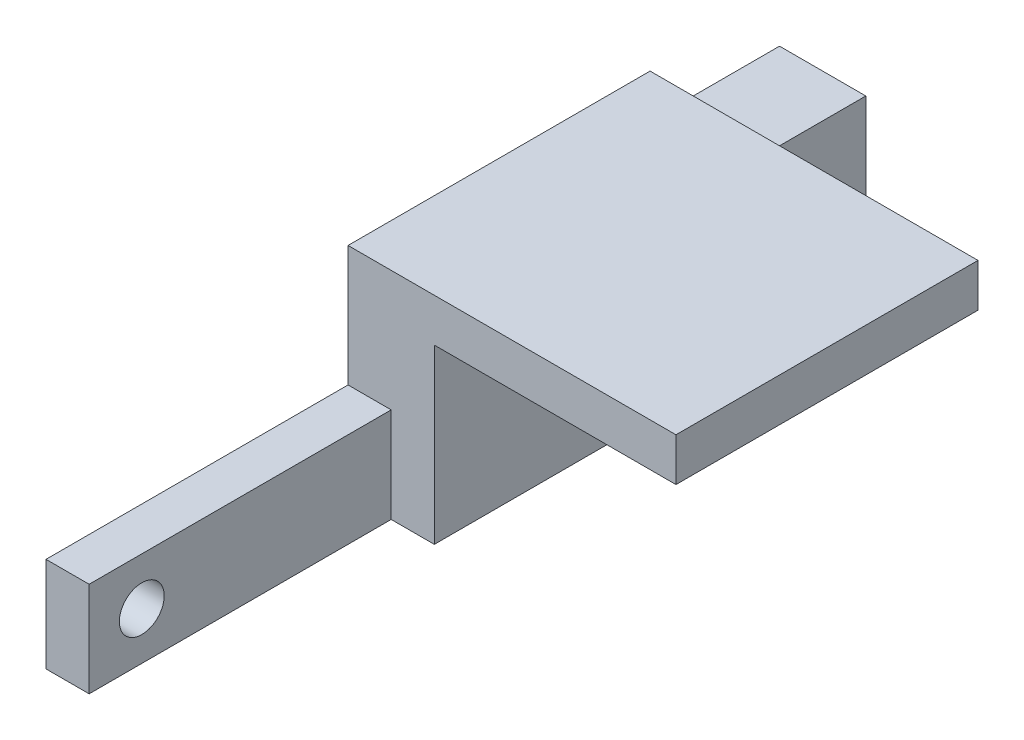
ISO-10303-21;
HEADER;
FILE_DESCRIPTION(('STEP AP214'),'2;1');
FILE_NAME('part.step','',(''),(''),'','','');
FILE_SCHEMA(('AUTOMOTIVE_DESIGN { 1 0 10303 214 1 1 1 1 }'));
ENDSEC;
DATA;
#1=APPLICATION_CONTEXT('core data for automotive mechanical design processes');
#2=APPLICATION_PROTOCOL_DEFINITION('international standard','automotive_design',2000,#1);
#3=PRODUCT_CONTEXT('',#1,'mechanical');
#4=PRODUCT('Part','Part','',(#3));
#5=PRODUCT_RELATED_PRODUCT_CATEGORY('part','',(#4));
#6=PRODUCT_DEFINITION_FORMATION('','',#4);
#7=PRODUCT_DEFINITION_CONTEXT('part definition',#1,'design');
#8=PRODUCT_DEFINITION('design','',#6,#7);
#9=PRODUCT_DEFINITION_SHAPE('','',#8);
#10=(LENGTH_UNIT() NAMED_UNIT(*) SI_UNIT(.MILLI.,.METRE.));
#11=(NAMED_UNIT(*) PLANE_ANGLE_UNIT() SI_UNIT($,.RADIAN.));
#12=(NAMED_UNIT(*) SI_UNIT($,.STERADIAN.) SOLID_ANGLE_UNIT());
#13=UNCERTAINTY_MEASURE_WITH_UNIT(LENGTH_MEASURE(1.E-05),#10,'distance_accuracy_value','');
#14=(GEOMETRIC_REPRESENTATION_CONTEXT(3) GLOBAL_UNCERTAINTY_ASSIGNED_CONTEXT((#13)) GLOBAL_UNIT_ASSIGNED_CONTEXT((#10,
#11,#12)) REPRESENTATION_CONTEXT('',''));
#15=CARTESIAN_POINT('',(0.,0.,0.));
#16=DIRECTION('',(0.,0.,1.));
#17=DIRECTION('',(1.,0.,0.));
#18=AXIS2_PLACEMENT_3D('',#15,#16,#17);
#19=CARTESIAN_POINT('',(38.,5.,35.));
#20=DIRECTION('',(0.,0.,1.));
#21=DIRECTION('',(1.,0.,0.));
#22=AXIS2_PLACEMENT_3D('',#19,#20,#21);
#23=PLANE('',#22);
#24=DIRECTION('',(0.,-1.,0.));
#25=VECTOR('',#24,1.);
#26=CARTESIAN_POINT('',(0.,5.,35.));
#27=LINE('',#26,#25);
#28=CARTESIAN_POINT('',(0.,5.,35.));
#29=VERTEX_POINT('',#28);
#30=CARTESIAN_POINT('',(0.,-8.99999999999996,35.));
#31=VERTEX_POINT('',#30);
#32=EDGE_CURVE('E212',#29,#31,#27,.T.);
#33=ORIENTED_EDGE('',*,*,#32,.T.);
#34=DIRECTION('',(1.,0.,0.));
#35=VECTOR('',#34,1.);
#36=CARTESIAN_POINT('',(-36.6878726556883,-8.99999999999996,35.));
#37=LINE('',#36,#35);
#38=CARTESIAN_POINT('',(5.,-8.99999999999996,35.));
#39=VERTEX_POINT('',#38);
#40=EDGE_CURVE('E156',#31,#39,#37,.T.);
#41=ORIENTED_EDGE('',*,*,#40,.T.);
#42=DIRECTION('',(0.,-1.,0.));
#43=VECTOR('',#42,1.);
#44=CARTESIAN_POINT('',(5.,-8.99999999999996,35.));
#45=LINE('',#44,#43);
#46=CARTESIAN_POINT('',(5.,-20.,35.));
#47=VERTEX_POINT('',#46);
#48=EDGE_CURVE('E150',#39,#47,#45,.T.);
#49=ORIENTED_EDGE('',*,*,#48,.T.);
#50=DIRECTION('',(-1.,0.,0.));
#51=VECTOR('',#50,1.);
#52=CARTESIAN_POINT('',(10.,-20.,35.));
#53=LINE('',#52,#51);
#54=CARTESIAN_POINT('',(10.,-20.,35.));
#55=VERTEX_POINT('',#54);
#56=EDGE_CURVE('E149',#55,#47,#53,.T.);
#57=ORIENTED_EDGE('',*,*,#56,.F.);
#58=DIRECTION('',(0.,1.,0.));
#59=VECTOR('',#58,1.);
#60=CARTESIAN_POINT('',(10.,-20.,35.));
#61=LINE('',#60,#59);
#62=CARTESIAN_POINT('',(10.,0.,35.));
#63=VERTEX_POINT('',#62);
#64=EDGE_CURVE('E185',#55,#63,#61,.T.);
#65=ORIENTED_EDGE('',*,*,#64,.T.);
#66=DIRECTION('',(-1.,0.,0.));
#67=VECTOR('',#66,1.);
#68=CARTESIAN_POINT('',(38.,0.,35.));
#69=LINE('',#68,#67);
#70=CARTESIAN_POINT('',(38.,0.,35.));
#71=VERTEX_POINT('',#70);
#72=EDGE_CURVE('E205',#71,#63,#69,.T.);
#73=ORIENTED_EDGE('',*,*,#72,.F.);
#74=DIRECTION('',(0.,-1.,0.));
#75=VECTOR('',#74,1.);
#76=CARTESIAN_POINT('',(38.,5.,35.));
#77=LINE('',#76,#75);
#78=CARTESIAN_POINT('',(38.,5.,35.));
#79=VERTEX_POINT('',#78);
#80=EDGE_CURVE('E56',#79,#71,#77,.T.);
#81=ORIENTED_EDGE('',*,*,#80,.F.);
#82=DIRECTION('',(-1.,0.,0.));
#83=VECTOR('',#82,1.);
#84=CARTESIAN_POINT('',(38.,5.,35.));
#85=LINE('',#84,#83);
#86=EDGE_CURVE('E195',#79,#29,#85,.T.);
#87=ORIENTED_EDGE('',*,*,#86,.T.);
#88=EDGE_LOOP('',(#33,#41,#49,#57,#65,#73,#81,#87));
#89=FACE_BOUND('',#88,.T.);
#90=ADVANCED_FACE('F52',(#89),#23,.T.);
#91=CARTESIAN_POINT('',(0.,0.,0.));
#92=DIRECTION('',(0.,-1.,0.));
#93=DIRECTION('',(0.,0.,-1.));
#94=AXIS2_PLACEMENT_3D('',#91,#92,#93);
#95=PLANE('',#94);
#96=ORIENTED_EDGE('',*,*,#72,.T.);
#97=DIRECTION('',(0.,0.,-1.));
#98=VECTOR('',#97,1.);
#99=CARTESIAN_POINT('',(10.,0.,35.));
#100=LINE('',#99,#98);
#101=CARTESIAN_POINT('',(10.,0.,0.));
#102=VERTEX_POINT('',#101);
#103=EDGE_CURVE('E178',#63,#102,#100,.T.);
#104=ORIENTED_EDGE('',*,*,#103,.T.);
#105=DIRECTION('',(-1.,0.,0.));
#106=VECTOR('',#105,1.);
#107=CARTESIAN_POINT('',(38.,0.,0.));
#108=LINE('',#107,#106);
#109=CARTESIAN_POINT('',(38.,0.,0.));
#110=VERTEX_POINT('',#109);
#111=EDGE_CURVE('E196',#110,#102,#108,.T.);
#112=ORIENTED_EDGE('',*,*,#111,.F.);
#113=DIRECTION('',(0.,0.,1.));
#114=VECTOR('',#113,1.);
#115=CARTESIAN_POINT('',(38.,0.,0.));
#116=LINE('',#115,#114);
#117=EDGE_CURVE('E187',#110,#71,#116,.T.);
#118=ORIENTED_EDGE('',*,*,#117,.T.);
#119=EDGE_LOOP('',(#96,#104,#112,#118));
#120=FACE_BOUND('',#119,.T.);
#121=ADVANCED_FACE('F223',(#120),#95,.T.);
#122=CARTESIAN_POINT('',(38.,5.,0.));
#123=DIRECTION('',(1.,0.,0.));
#124=DIRECTION('',(0.,0.,-1.));
#125=AXIS2_PLACEMENT_3D('',#122,#123,#124);
#126=PLANE('',#125);
#127=ORIENTED_EDGE('',*,*,#117,.F.);
#128=DIRECTION('',(0.,-1.,0.));
#129=VECTOR('',#128,1.);
#130=CARTESIAN_POINT('',(38.,5.,0.));
#131=LINE('',#130,#129);
#132=CARTESIAN_POINT('',(38.,5.,0.));
#133=VERTEX_POINT('',#132);
#134=EDGE_CURVE('E12',#133,#110,#131,.T.);
#135=ORIENTED_EDGE('',*,*,#134,.F.);
#136=DIRECTION('',(0.,0.,1.));
#137=VECTOR('',#136,1.);
#138=CARTESIAN_POINT('',(38.,5.,0.));
#139=LINE('',#138,#137);
#140=EDGE_CURVE('E192',#133,#79,#139,.T.);
#141=ORIENTED_EDGE('',*,*,#140,.T.);
#142=ORIENTED_EDGE('',*,*,#80,.T.);
#143=EDGE_LOOP('',(#127,#135,#141,#142));
#144=FACE_BOUND('',#143,.T.);
#145=ADVANCED_FACE('F54',(#144),#126,.T.);
#146=CARTESIAN_POINT('',(38.,5.,0.));
#147=DIRECTION('',(0.,0.,1.));
#148=DIRECTION('',(1.,0.,0.));
#149=AXIS2_PLACEMENT_3D('',#146,#147,#148);
#150=PLANE('',#149);
#151=ORIENTED_EDGE('',*,*,#111,.T.);
#152=CARTESIAN_POINT('',(0.,0.,0.));
#153=VERTEX_POINT('',#152);
#154=EDGE_CURVE('E208',#102,#153,#108,.T.);
#155=ORIENTED_EDGE('',*,*,#154,.T.);
#156=DIRECTION('',(0.,-1.,0.));
#157=VECTOR('',#156,1.);
#158=CARTESIAN_POINT('',(0.,5.,0.));
#159=LINE('',#158,#157);
#160=CARTESIAN_POINT('',(0.,5.,0.));
#161=VERTEX_POINT('',#160);
#162=EDGE_CURVE('E61',#161,#153,#159,.T.);
#163=ORIENTED_EDGE('',*,*,#162,.F.);
#164=DIRECTION('',(-1.,0.,0.));
#165=VECTOR('',#164,1.);
#166=CARTESIAN_POINT('',(38.,5.,0.));
#167=LINE('',#166,#165);
#168=EDGE_CURVE('E201',#133,#161,#167,.T.);
#169=ORIENTED_EDGE('',*,*,#168,.F.);
#170=ORIENTED_EDGE('',*,*,#134,.T.);
#171=EDGE_LOOP('',(#151,#155,#163,#169,#170));
#172=FACE_BOUND('',#171,.T.);
#173=ADVANCED_FACE('F226',(#172),#150,.F.);
#174=CARTESIAN_POINT('',(0.,5.,0.));
#175=DIRECTION('',(1.,0.,0.));
#176=DIRECTION('',(0.,0.,-1.));
#177=AXIS2_PLACEMENT_3D('',#174,#175,#176);
#178=PLANE('',#177);
#179=CARTESIAN_POINT('',(0.,-14.5,56.3000000000001));
#180=DIRECTION('',(1.,0.,0.));
#181=DIRECTION('',(0.,0.,-1.));
#182=AXIS2_PLACEMENT_3D('',#179,#180,#181);
#183=CIRCLE('',#182,0.599999999999993);
#184=CARTESIAN_POINT('',(0.,-14.5,55.7000000000001));
#185=VERTEX_POINT('',#184);
#186=EDGE_CURVE('E252',#185,#185,#183,.T.);
#187=ORIENTED_EDGE('',*,*,#186,.T.);
#188=EDGE_LOOP('',(#187));
#189=FACE_BOUND('',#188,.T.);
#190=CARTESIAN_POINT('',(0.,-14.5,51.4000000000001));
#191=DIRECTION('',(1.,0.,0.));
#192=DIRECTION('',(0.,0.,-1.));
#193=AXIS2_PLACEMENT_3D('',#190,#191,#192);
#194=CIRCLE('',#193,1.5);
#195=CARTESIAN_POINT('',(0.,-14.5,49.9000000000001));
#196=VERTEX_POINT('',#195);
#197=EDGE_CURVE('E249',#196,#196,#194,.T.);
#198=ORIENTED_EDGE('',*,*,#197,.T.);
#199=EDGE_LOOP('',(#198));
#200=FACE_BOUND('',#199,.T.);
#201=ORIENTED_EDGE('',*,*,#162,.T.);
#202=DIRECTION('',(0.,0.,-1.));
#203=VECTOR('',#202,1.);
#204=CARTESIAN_POINT('',(0.,0.,35.));
#205=LINE('',#204,#203);
#206=CARTESIAN_POINT('',(0.,0.,-15.));
#207=VERTEX_POINT('',#206);
#208=EDGE_CURVE('E171',#153,#207,#205,.T.);
#209=ORIENTED_EDGE('',*,*,#208,.T.);
#210=DIRECTION('',(0.,1.,0.));
#211=VECTOR('',#210,1.);
#212=CARTESIAN_POINT('',(0.,-20.,-15.));
#213=LINE('',#212,#211);
#214=CARTESIAN_POINT('',(0.,-20.,-15.));
#215=VERTEX_POINT('',#214);
#216=EDGE_CURVE('E188',#215,#207,#213,.T.);
#217=ORIENTED_EDGE('',*,*,#216,.F.);
#218=DIRECTION('',(0.,0.,-1.));
#219=VECTOR('',#218,1.);
#220=CARTESIAN_POINT('',(0.,-20.,35.));
#221=LINE('',#220,#219);
#222=CARTESIAN_POINT('',(0.,-20.,70.));
#223=VERTEX_POINT('',#222);
#224=EDGE_CURVE('E174',#223,#215,#221,.T.);
#225=ORIENTED_EDGE('',*,*,#224,.F.);
#226=DIRECTION('',(0.,1.,0.));
#227=VECTOR('',#226,1.);
#228=CARTESIAN_POINT('',(0.,-8.99999999999997,70.));
#229=LINE('',#228,#227);
#230=CARTESIAN_POINT('',(0.,-8.99999999999997,70.));
#231=VERTEX_POINT('',#230);
#232=EDGE_CURVE('E141',#223,#231,#229,.T.);
#233=ORIENTED_EDGE('',*,*,#232,.T.);
#234=DIRECTION('',(0.,0.,-1.));
#235=VECTOR('',#234,1.);
#236=CARTESIAN_POINT('',(0.,-8.99999999999996,35.));
#237=LINE('',#236,#235);
#238=EDGE_CURVE('E166',#231,#31,#237,.T.);
#239=ORIENTED_EDGE('',*,*,#238,.T.);
#240=ORIENTED_EDGE('',*,*,#32,.F.);
#241=DIRECTION('',(0.,0.,1.));
#242=VECTOR('',#241,1.);
#243=CARTESIAN_POINT('',(0.,5.,0.));
#244=LINE('',#243,#242);
#245=EDGE_CURVE('E199',#161,#29,#244,.T.);
#246=ORIENTED_EDGE('',*,*,#245,.F.);
#247=EDGE_LOOP('',(#201,#209,#217,#225,#233,#239,#240,#246));
#248=FACE_BOUND('',#247,.T.);
#249=CARTESIAN_POINT('',(0.,-14.5,63.9000000000001));
#250=DIRECTION('',(1.,0.,0.));
#251=DIRECTION('',(0.,0.,-1.));
#252=AXIS2_PLACEMENT_3D('',#249,#250,#251);
#253=CIRCLE('',#252,2.6);
#254=CARTESIAN_POINT('',(0.,-14.5,61.3000000000001));
#255=VERTEX_POINT('',#254);
#256=EDGE_CURVE('E163',#255,#255,#253,.F.);
#257=ORIENTED_EDGE('',*,*,#256,.F.);
#258=EDGE_LOOP('',(#257));
#259=FACE_BOUND('',#258,.T.);
#260=ADVANCED_FACE('F233',(#189,#200,#248,#259),#178,.F.);
#261=CARTESIAN_POINT('',(0.,5.,0.));
#262=DIRECTION('',(0.,-1.,0.));
#263=DIRECTION('',(0.,0.,-1.));
#264=AXIS2_PLACEMENT_3D('',#261,#262,#263);
#265=PLANE('',#264);
#266=ORIENTED_EDGE('',*,*,#140,.F.);
#267=ORIENTED_EDGE('',*,*,#168,.T.);
#268=ORIENTED_EDGE('',*,*,#245,.T.);
#269=ORIENTED_EDGE('',*,*,#86,.F.);
#270=EDGE_LOOP('',(#266,#267,#268,#269));
#271=FACE_BOUND('',#270,.T.);
#272=ADVANCED_FACE('F231',(#271),#265,.F.);
#273=CARTESIAN_POINT('',(0.,0.,0.));
#274=DIRECTION('',(0.,1.,0.));
#275=DIRECTION('',(0.,0.,1.));
#276=AXIS2_PLACEMENT_3D('',#273,#274,#275);
#277=PLANE('',#276);
#278=ORIENTED_EDGE('',*,*,#154,.F.);
#279=CARTESIAN_POINT('',(10.,0.,-15.));
#280=VERTEX_POINT('',#279);
#281=EDGE_CURVE('E77',#102,#280,#100,.T.);
#282=ORIENTED_EDGE('',*,*,#281,.T.);
#283=DIRECTION('',(-1.,0.,0.));
#284=VECTOR('',#283,1.);
#285=CARTESIAN_POINT('',(10.,0.,-15.));
#286=LINE('',#285,#284);
#287=EDGE_CURVE('E181',#280,#207,#286,.T.);
#288=ORIENTED_EDGE('',*,*,#287,.T.);
#289=ORIENTED_EDGE('',*,*,#208,.F.);
#290=EDGE_LOOP('',(#278,#282,#288,#289));
#291=FACE_BOUND('',#290,.T.);
#292=ADVANCED_FACE('F282',(#291),#277,.T.);
#293=CARTESIAN_POINT('',(10.,-20.,35.));
#294=DIRECTION('',(1.,0.,0.));
#295=DIRECTION('',(0.,0.,-1.));
#296=AXIS2_PLACEMENT_3D('',#293,#294,#295);
#297=PLANE('',#296);
#298=ORIENTED_EDGE('',*,*,#103,.F.);
#299=ORIENTED_EDGE('',*,*,#64,.F.);
#300=DIRECTION('',(0.,0.,-1.));
#301=VECTOR('',#300,1.);
#302=CARTESIAN_POINT('',(10.,-20.,35.));
#303=LINE('',#302,#301);
#304=CARTESIAN_POINT('',(10.,-20.,-15.));
#305=VERTEX_POINT('',#304);
#306=EDGE_CURVE('E167',#55,#305,#303,.T.);
#307=ORIENTED_EDGE('',*,*,#306,.T.);
#308=DIRECTION('',(0.,1.,0.));
#309=VECTOR('',#308,1.);
#310=CARTESIAN_POINT('',(10.,-20.,-15.));
#311=LINE('',#310,#309);
#312=EDGE_CURVE('E177',#305,#280,#311,.T.);
#313=ORIENTED_EDGE('',*,*,#312,.T.);
#314=ORIENTED_EDGE('',*,*,#281,.F.);
#315=EDGE_LOOP('',(#298,#299,#307,#313,#314));
#316=FACE_BOUND('',#315,.T.);
#317=ADVANCED_FACE('F283',(#316),#297,.T.);
#318=CARTESIAN_POINT('',(10.,-20.,-15.));
#319=DIRECTION('',(0.,0.,-1.));
#320=DIRECTION('',(-1.,0.,0.));
#321=AXIS2_PLACEMENT_3D('',#318,#319,#320);
#322=PLANE('',#321);
#323=ORIENTED_EDGE('',*,*,#287,.F.);
#324=ORIENTED_EDGE('',*,*,#312,.F.);
#325=DIRECTION('',(-1.,0.,0.));
#326=VECTOR('',#325,1.);
#327=CARTESIAN_POINT('',(10.,-20.,-15.));
#328=LINE('',#327,#326);
#329=EDGE_CURVE('E170',#305,#215,#328,.T.);
#330=ORIENTED_EDGE('',*,*,#329,.T.);
#331=ORIENTED_EDGE('',*,*,#216,.T.);
#332=EDGE_LOOP('',(#323,#324,#330,#331));
#333=FACE_BOUND('',#332,.T.);
#334=ADVANCED_FACE('F286',(#333),#322,.T.);
#335=CARTESIAN_POINT('',(0.,-20.,0.));
#336=DIRECTION('',(0.,1.,0.));
#337=DIRECTION('',(0.,0.,1.));
#338=AXIS2_PLACEMENT_3D('',#335,#336,#337);
#339=PLANE('',#338);
#340=ORIENTED_EDGE('',*,*,#306,.F.);
#341=ORIENTED_EDGE('',*,*,#56,.T.);
#342=DIRECTION('',(0.,0.,1.));
#343=VECTOR('',#342,1.);
#344=CARTESIAN_POINT('',(5.,-20.,35.));
#345=LINE('',#344,#343);
#346=CARTESIAN_POINT('',(5.,-20.,70.));
#347=VERTEX_POINT('',#346);
#348=EDGE_CURVE('E69',#47,#347,#345,.T.);
#349=ORIENTED_EDGE('',*,*,#348,.T.);
#350=DIRECTION('',(1.,0.,0.));
#351=VECTOR('',#350,1.);
#352=CARTESIAN_POINT('',(-36.6878726556883,-20.,70.));
#353=LINE('',#352,#351);
#354=EDGE_CURVE('E136',#223,#347,#353,.T.);
#355=ORIENTED_EDGE('',*,*,#354,.F.);
#356=ORIENTED_EDGE('',*,*,#224,.T.);
#357=ORIENTED_EDGE('',*,*,#329,.F.);
#358=EDGE_LOOP('',(#340,#341,#349,#355,#356,#357));
#359=FACE_BOUND('',#358,.T.);
#360=ADVANCED_FACE('F147',(#359),#339,.F.);
#361=CARTESIAN_POINT('',(-36.6878726556883,-8.99999999999996,35.));
#362=DIRECTION('',(0.,1.,0.));
#363=DIRECTION('',(0.,0.,1.));
#364=AXIS2_PLACEMENT_3D('',#361,#362,#363);
#365=PLANE('',#364);
#366=ORIENTED_EDGE('',*,*,#238,.F.);
#367=DIRECTION('',(1.,0.,0.));
#368=VECTOR('',#367,1.);
#369=CARTESIAN_POINT('',(-36.6878726556883,-8.99999999999997,70.));
#370=LINE('',#369,#368);
#371=CARTESIAN_POINT('',(5.,-8.99999999999997,70.));
#372=VERTEX_POINT('',#371);
#373=EDGE_CURVE('E143',#231,#372,#370,.T.);
#374=ORIENTED_EDGE('',*,*,#373,.T.);
#375=DIRECTION('',(0.,0.,1.));
#376=VECTOR('',#375,1.);
#377=CARTESIAN_POINT('',(5.,-8.99999999999996,35.));
#378=LINE('',#377,#376);
#379=EDGE_CURVE('E154',#39,#372,#378,.T.);
#380=ORIENTED_EDGE('',*,*,#379,.F.);
#381=ORIENTED_EDGE('',*,*,#40,.F.);
#382=EDGE_LOOP('',(#366,#374,#380,#381));
#383=FACE_BOUND('',#382,.T.);
#384=ADVANCED_FACE('F239',(#383),#365,.T.);
#385=CARTESIAN_POINT('',(-36.6878726556883,-8.99999999999997,70.));
#386=DIRECTION('',(0.,0.,1.));
#387=DIRECTION('',(1.,0.,0.));
#388=AXIS2_PLACEMENT_3D('',#385,#386,#387);
#389=PLANE('',#388);
#390=ORIENTED_EDGE('',*,*,#232,.F.);
#391=ORIENTED_EDGE('',*,*,#354,.T.);
#392=DIRECTION('',(0.,-1.,0.));
#393=VECTOR('',#392,1.);
#394=CARTESIAN_POINT('',(5.,-8.99999999999997,70.));
#395=LINE('',#394,#393);
#396=EDGE_CURVE('E139',#372,#347,#395,.T.);
#397=ORIENTED_EDGE('',*,*,#396,.F.);
#398=ORIENTED_EDGE('',*,*,#373,.F.);
#399=EDGE_LOOP('',(#390,#391,#397,#398));
#400=FACE_BOUND('',#399,.T.);
#401=ADVANCED_FACE('F137',(#400),#389,.T.);
#402=CARTESIAN_POINT('',(5.,0.,0.));
#403=DIRECTION('',(-1.,0.,0.));
#404=DIRECTION('',(0.,0.,1.));
#405=AXIS2_PLACEMENT_3D('',#402,#403,#404);
#406=PLANE('',#405);
#407=CARTESIAN_POINT('',(5.,-14.5,63.9000000000001));
#408=DIRECTION('',(1.,0.,0.));
#409=DIRECTION('',(0.,0.,-1.));
#410=AXIS2_PLACEMENT_3D('',#407,#408,#409);
#411=CIRCLE('',#410,2.6);
#412=CARTESIAN_POINT('',(5.,-14.5,61.3000000000001));
#413=VERTEX_POINT('',#412);
#414=EDGE_CURVE('E240',#413,#413,#411,.T.);
#415=ORIENTED_EDGE('',*,*,#414,.F.);
#416=EDGE_LOOP('',(#415));
#417=FACE_BOUND('',#416,.T.);
#418=ORIENTED_EDGE('',*,*,#48,.F.);
#419=ORIENTED_EDGE('',*,*,#379,.T.);
#420=ORIENTED_EDGE('',*,*,#396,.T.);
#421=ORIENTED_EDGE('',*,*,#348,.F.);
#422=EDGE_LOOP('',(#418,#419,#420,#421));
#423=FACE_BOUND('',#422,.T.);
#424=ADVANCED_FACE('F152',(#417,#423),#406,.F.);
#425=CARTESIAN_POINT('',(-36.6878726556883,-14.5,63.9000000000001));
#426=DIRECTION('',(1.,0.,0.));
#427=DIRECTION('',(0.,0.,-1.));
#428=AXIS2_PLACEMENT_3D('',#425,#426,#427);
#429=CYLINDRICAL_SURFACE('',#428,2.6);
#430=ORIENTED_EDGE('',*,*,#256,.T.);
#431=EDGE_LOOP('',(#430));
#432=FACE_BOUND('',#431,.T.);
#433=ORIENTED_EDGE('',*,*,#414,.T.);
#434=EDGE_LOOP('',(#433));
#435=FACE_BOUND('',#434,.T.);
#436=ADVANCED_FACE('F301',(#432,#435),#429,.F.);
#437=CARTESIAN_POINT('',(3.00000000000001,-14.5,51.4000000000001));
#438=DIRECTION('',(-1.,0.,0.));
#439=DIRECTION('',(0.,0.,1.));
#440=AXIS2_PLACEMENT_3D('',#437,#438,#439);
#441=CYLINDRICAL_SURFACE('',#440,1.5);
#442=CARTESIAN_POINT('',(3.00000000000001,-14.5,51.4000000000001));
#443=DIRECTION('',(1.,0.,0.));
#444=DIRECTION('',(0.,0.,-1.));
#445=AXIS2_PLACEMENT_3D('',#442,#443,#444);
#446=CIRCLE('',#445,1.5);
#447=CARTESIAN_POINT('',(3.00000000000001,-14.5,49.9000000000001));
#448=VERTEX_POINT('',#447);
#449=EDGE_CURVE('E246',#448,#448,#446,.T.);
#450=ORIENTED_EDGE('',*,*,#449,.T.);
#451=EDGE_LOOP('',(#450));
#452=FACE_BOUND('',#451,.T.);
#453=ORIENTED_EDGE('',*,*,#197,.F.);
#454=EDGE_LOOP('',(#453));
#455=FACE_BOUND('',#454,.T.);
#456=ADVANCED_FACE('F305',(#452,#455),#441,.F.);
#457=CARTESIAN_POINT('',(3.00000000000001,-14.5,51.4000000000001));
#458=DIRECTION('',(1.,0.,0.));
#459=DIRECTION('',(0.,0.,-1.));
#460=AXIS2_PLACEMENT_3D('',#457,#458,#459);
#461=PLANE('',#460);
#462=ORIENTED_EDGE('',*,*,#449,.F.);
#463=EDGE_LOOP('',(#462));
#464=FACE_BOUND('',#463,.T.);
#465=ADVANCED_FACE('F267',(#464),#461,.F.);
#466=CARTESIAN_POINT('',(3.00000000000001,-14.5,56.3000000000001));
#467=DIRECTION('',(-1.,0.,0.));
#468=DIRECTION('',(0.,0.,1.));
#469=AXIS2_PLACEMENT_3D('',#466,#467,#468);
#470=CYLINDRICAL_SURFACE('',#469,0.599999999999993);
#471=CARTESIAN_POINT('',(3.00000000000001,-14.5,56.3000000000001));
#472=DIRECTION('',(1.,0.,0.));
#473=DIRECTION('',(0.,0.,-1.));
#474=AXIS2_PLACEMENT_3D('',#471,#472,#473);
#475=CIRCLE('',#474,0.599999999999993);
#476=CARTESIAN_POINT('',(3.00000000000001,-14.5,55.7000000000001));
#477=VERTEX_POINT('',#476);
#478=EDGE_CURVE('E242',#477,#477,#475,.T.);
#479=ORIENTED_EDGE('',*,*,#478,.T.);
#480=EDGE_LOOP('',(#479));
#481=FACE_BOUND('',#480,.T.);
#482=ORIENTED_EDGE('',*,*,#186,.F.);
#483=EDGE_LOOP('',(#482));
#484=FACE_BOUND('',#483,.T.);
#485=ADVANCED_FACE('F258',(#481,#484),#470,.F.);
#486=CARTESIAN_POINT('',(3.00000000000001,-14.5,56.3000000000001));
#487=DIRECTION('',(1.,0.,0.));
#488=DIRECTION('',(0.,0.,-1.));
#489=AXIS2_PLACEMENT_3D('',#486,#487,#488);
#490=PLANE('',#489);
#491=ORIENTED_EDGE('',*,*,#478,.F.);
#492=EDGE_LOOP('',(#491));
#493=FACE_BOUND('',#492,.T.);
#494=ADVANCED_FACE('F261',(#493),#490,.F.);
#495=CLOSED_SHELL('',(#90,#121,#145,#173,#260,#272,#292,#317,#334,#360,#384,#401,#424,#436,#456,
#465,#485,#494));
#496=MANIFOLD_SOLID_BREP('B2',#495);
#497=ADVANCED_BREP_SHAPE_REPRESENTATION('',(#18,#496),#14);
#498=SHAPE_DEFINITION_REPRESENTATION(#9,#497);
ENDSEC;
END-ISO-10303-21;
